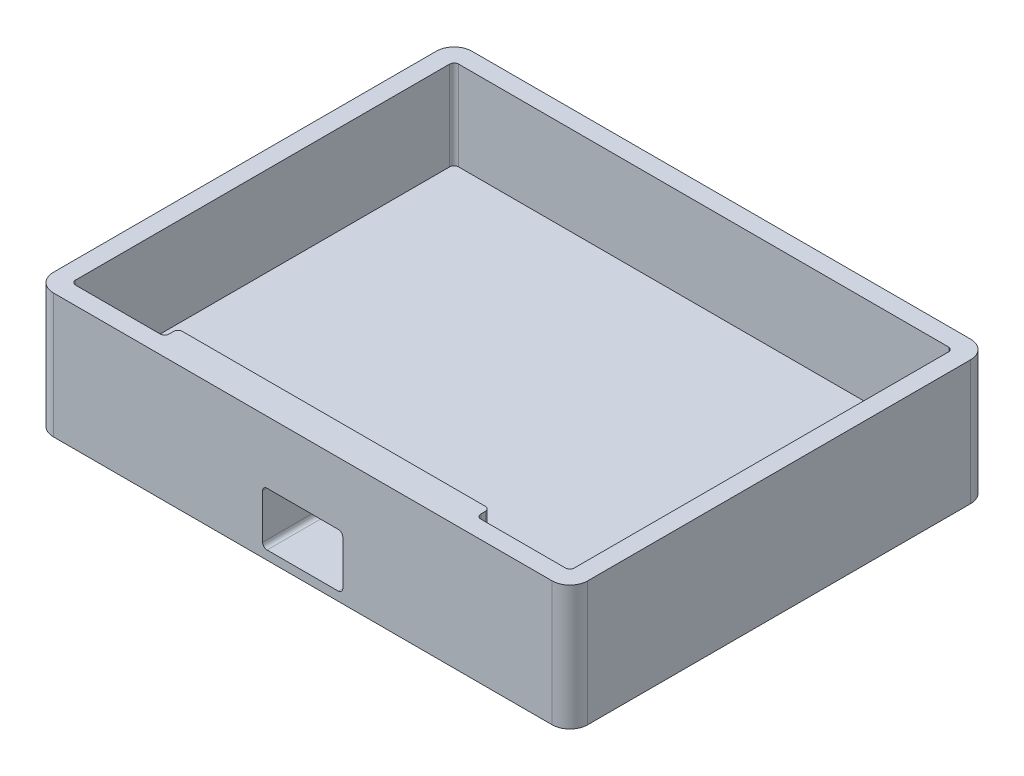
ISO-10303-21;
HEADER;
FILE_DESCRIPTION(('STEP AP214'),'2;1');
FILE_NAME('part.step','',(''),(''),'','','');
FILE_SCHEMA(('AUTOMOTIVE_DESIGN { 1 0 10303 214 1 1 1 1 }'));
ENDSEC;
DATA;
#1=APPLICATION_CONTEXT('core data for automotive mechanical design processes');
#2=APPLICATION_PROTOCOL_DEFINITION('international standard','automotive_design',2000,#1);
#3=PRODUCT_CONTEXT('',#1,'mechanical');
#4=PRODUCT('Part','Part','',(#3));
#5=PRODUCT_RELATED_PRODUCT_CATEGORY('part','',(#4));
#6=PRODUCT_DEFINITION_FORMATION('','',#4);
#7=PRODUCT_DEFINITION_CONTEXT('part definition',#1,'design');
#8=PRODUCT_DEFINITION('design','',#6,#7);
#9=PRODUCT_DEFINITION_SHAPE('','',#8);
#10=(LENGTH_UNIT() NAMED_UNIT(*) SI_UNIT(.MILLI.,.METRE.));
#11=(NAMED_UNIT(*) PLANE_ANGLE_UNIT() SI_UNIT($,.RADIAN.));
#12=(NAMED_UNIT(*) SI_UNIT($,.STERADIAN.) SOLID_ANGLE_UNIT());
#13=UNCERTAINTY_MEASURE_WITH_UNIT(LENGTH_MEASURE(1.E-05),#10,'distance_accuracy_value','');
#14=(GEOMETRIC_REPRESENTATION_CONTEXT(3) GLOBAL_UNCERTAINTY_ASSIGNED_CONTEXT((#13)) GLOBAL_UNIT_ASSIGNED_CONTEXT((#10,
#11,#12)) REPRESENTATION_CONTEXT('',''));
#15=CARTESIAN_POINT('',(0.,0.,0.));
#16=DIRECTION('',(0.,0.,1.));
#17=DIRECTION('',(1.,0.,0.));
#18=AXIS2_PLACEMENT_3D('',#15,#16,#17);
#19=CARTESIAN_POINT('',(0.,4.,0.));
#20=DIRECTION('',(0.,-1.,0.));
#21=DIRECTION('',(0.,0.,-1.));
#22=AXIS2_PLACEMENT_3D('',#19,#20,#21);
#23=PLANE('',#22);
#24=DIRECTION('',(0.,0.,-1.));
#25=VECTOR('',#24,1.);
#26=CARTESIAN_POINT('',(17.5,4.,0.));
#27=LINE('',#26,#25);
#28=CARTESIAN_POINT('',(17.5,4.,21.));
#29=VERTEX_POINT('',#28);
#30=CARTESIAN_POINT('',(17.5,4.,20.5));
#31=VERTEX_POINT('',#30);
#32=EDGE_CURVE('E394',#29,#31,#27,.T.);
#33=ORIENTED_EDGE('',*,*,#32,.F.);
#34=CARTESIAN_POINT('',(18.,4.,21.));
#35=DIRECTION('',(0.,-1.,0.));
#36=DIRECTION('',(0.,0.,-1.));
#37=AXIS2_PLACEMENT_3D('',#34,#35,#36);
#38=CIRCLE('',#37,0.5);
#39=CARTESIAN_POINT('',(18.,4.,21.5));
#40=VERTEX_POINT('',#39);
#41=EDGE_CURVE('E503',#29,#40,#38,.F.);
#42=ORIENTED_EDGE('',*,*,#41,.T.);
#43=DIRECTION('',(1.,0.,0.));
#44=VECTOR('',#43,1.);
#45=CARTESIAN_POINT('',(-28.,4.,21.5));
#46=LINE('',#45,#44);
#47=CARTESIAN_POINT('',(27.5,4.,21.5));
#48=VERTEX_POINT('',#47);
#49=EDGE_CURVE('E355',#40,#48,#46,.T.);
#50=ORIENTED_EDGE('',*,*,#49,.T.);
#51=CARTESIAN_POINT('',(27.5,4.,21.));
#52=DIRECTION('',(0.,-1.,0.));
#53=DIRECTION('',(0.,0.,-1.));
#54=AXIS2_PLACEMENT_3D('',#51,#52,#53);
#55=CIRCLE('',#54,0.5);
#56=CARTESIAN_POINT('',(28.,4.,21.));
#57=VERTEX_POINT('',#56);
#58=EDGE_CURVE('E492',#48,#57,#55,.F.);
#59=ORIENTED_EDGE('',*,*,#58,.T.);
#60=DIRECTION('',(0.,0.,-1.));
#61=VECTOR('',#60,1.);
#62=CARTESIAN_POINT('',(28.,4.,21.5));
#63=LINE('',#62,#61);
#64=CARTESIAN_POINT('',(28.,4.,-21.));
#65=VERTEX_POINT('',#64);
#66=EDGE_CURVE('E324',#57,#65,#63,.T.);
#67=ORIENTED_EDGE('',*,*,#66,.T.);
#68=CARTESIAN_POINT('',(27.5,4.,-21.));
#69=DIRECTION('',(0.,-1.,0.));
#70=DIRECTION('',(0.,0.,-1.));
#71=AXIS2_PLACEMENT_3D('',#68,#69,#70);
#72=CIRCLE('',#71,0.5);
#73=CARTESIAN_POINT('',(27.5,4.,-21.5));
#74=VERTEX_POINT('',#73);
#75=EDGE_CURVE('E494',#65,#74,#72,.F.);
#76=ORIENTED_EDGE('',*,*,#75,.T.);
#77=DIRECTION('',(-1.,0.,0.));
#78=VECTOR('',#77,1.);
#79=CARTESIAN_POINT('',(-28.,4.,-21.5));
#80=LINE('',#79,#78);
#81=CARTESIAN_POINT('',(-27.5,4.,-21.5));
#82=VERTEX_POINT('',#81);
#83=EDGE_CURVE('E347',#74,#82,#80,.T.);
#84=ORIENTED_EDGE('',*,*,#83,.T.);
#85=CARTESIAN_POINT('',(-27.5,4.,-21.));
#86=DIRECTION('',(0.,-1.,0.));
#87=DIRECTION('',(0.,0.,-1.));
#88=AXIS2_PLACEMENT_3D('',#85,#86,#87);
#89=CIRCLE('',#88,0.5);
#90=CARTESIAN_POINT('',(-28.,4.,-21.));
#91=VERTEX_POINT('',#90);
#92=EDGE_CURVE('E497',#82,#91,#89,.F.);
#93=ORIENTED_EDGE('',*,*,#92,.T.);
#94=DIRECTION('',(0.,0.,1.));
#95=VECTOR('',#94,1.);
#96=CARTESIAN_POINT('',(-28.,4.,21.5));
#97=LINE('',#96,#95);
#98=CARTESIAN_POINT('',(-28.,4.,21.));
#99=VERTEX_POINT('',#98);
#100=EDGE_CURVE('E351',#91,#99,#97,.T.);
#101=ORIENTED_EDGE('',*,*,#100,.T.);
#102=CARTESIAN_POINT('',(-27.5,4.,21.));
#103=DIRECTION('',(0.,-1.,0.));
#104=DIRECTION('',(0.,0.,-1.));
#105=AXIS2_PLACEMENT_3D('',#102,#103,#104);
#106=CIRCLE('',#105,0.5);
#107=CARTESIAN_POINT('',(-27.5,4.,21.5));
#108=VERTEX_POINT('',#107);
#109=EDGE_CURVE('E489',#99,#108,#106,.F.);
#110=ORIENTED_EDGE('',*,*,#109,.T.);
#111=CARTESIAN_POINT('',(-18.,4.,21.5));
#112=VERTEX_POINT('',#111);
#113=EDGE_CURVE('E330',#108,#112,#46,.T.);
#114=ORIENTED_EDGE('',*,*,#113,.T.);
#115=CARTESIAN_POINT('',(-18.,4.,21.));
#116=DIRECTION('',(0.,-1.,0.));
#117=DIRECTION('',(0.,0.,-1.));
#118=AXIS2_PLACEMENT_3D('',#115,#116,#117);
#119=CIRCLE('',#118,0.5);
#120=CARTESIAN_POINT('',(-17.5,4.,21.));
#121=VERTEX_POINT('',#120);
#122=EDGE_CURVE('E500',#112,#121,#119,.F.);
#123=ORIENTED_EDGE('',*,*,#122,.T.);
#124=DIRECTION('',(0.,0.,1.));
#125=VECTOR('',#124,1.);
#126=CARTESIAN_POINT('',(-17.5,4.,0.));
#127=LINE('',#126,#125);
#128=CARTESIAN_POINT('',(-17.5,4.,20.5));
#129=VERTEX_POINT('',#128);
#130=EDGE_CURVE('E398',#129,#121,#127,.T.);
#131=ORIENTED_EDGE('',*,*,#130,.F.);
#132=CARTESIAN_POINT('',(-17.,4.,20.5));
#133=DIRECTION('',(0.,-1.,0.));
#134=DIRECTION('',(0.,0.,-1.));
#135=AXIS2_PLACEMENT_3D('',#132,#133,#134);
#136=CIRCLE('',#135,0.5);
#137=CARTESIAN_POINT('',(-17.,4.,20.));
#138=VERTEX_POINT('',#137);
#139=EDGE_CURVE('E540',#129,#138,#136,.T.);
#140=ORIENTED_EDGE('',*,*,#139,.T.);
#141=DIRECTION('',(-1.,0.,0.));
#142=VECTOR('',#141,1.);
#143=CARTESIAN_POINT('',(0.,4.,20.));
#144=LINE('',#143,#142);
#145=CARTESIAN_POINT('',(-4.5,4.,20.));
#146=VERTEX_POINT('',#145);
#147=EDGE_CURVE('E300',#146,#138,#144,.T.);
#148=ORIENTED_EDGE('',*,*,#147,.F.);
#149=DIRECTION('',(0.,0.,1.));
#150=VECTOR('',#149,1.);
#151=CARTESIAN_POINT('',(-4.5,4.,0.));
#152=LINE('',#151,#150);
#153=CARTESIAN_POINT('',(-4.5,4.,15.5));
#154=VERTEX_POINT('',#153);
#155=EDGE_CURVE('E290',#154,#146,#152,.T.);
#156=ORIENTED_EDGE('',*,*,#155,.F.);
#157=DIRECTION('',(-1.,0.,0.));
#158=VECTOR('',#157,1.);
#159=CARTESIAN_POINT('',(0.,4.,15.5));
#160=LINE('',#159,#158);
#161=CARTESIAN_POINT('',(4.5,4.,15.5));
#162=VERTEX_POINT('',#161);
#163=EDGE_CURVE('E271',#162,#154,#160,.T.);
#164=ORIENTED_EDGE('',*,*,#163,.F.);
#165=DIRECTION('',(0.,0.,-1.));
#166=VECTOR('',#165,1.);
#167=CARTESIAN_POINT('',(4.5,4.,0.));
#168=LINE('',#167,#166);
#169=CARTESIAN_POINT('',(4.5,4.,20.));
#170=VERTEX_POINT('',#169);
#171=EDGE_CURVE('E302',#170,#162,#168,.T.);
#172=ORIENTED_EDGE('',*,*,#171,.F.);
#173=CARTESIAN_POINT('',(17.,4.,20.));
#174=VERTEX_POINT('',#173);
#175=EDGE_CURVE('E390',#174,#170,#144,.T.);
#176=ORIENTED_EDGE('',*,*,#175,.F.);
#177=CARTESIAN_POINT('',(17.,4.,20.5));
#178=DIRECTION('',(0.,-1.,0.));
#179=DIRECTION('',(0.,0.,-1.));
#180=AXIS2_PLACEMENT_3D('',#177,#178,#179);
#181=CIRCLE('',#180,0.5);
#182=EDGE_CURVE('E543',#174,#31,#181,.T.);
#183=ORIENTED_EDGE('',*,*,#182,.T.);
#184=EDGE_LOOP('',(#33,#42,#50,#59,#67,#76,#84,#93,#101,#110,#114,#123,#131,#140,#148,#156,#164,
#172,#176,#183));
#185=FACE_BOUND('',#184,.T.);
#186=ADVANCED_FACE('F49',(#185),#23,.F.);
#187=CARTESIAN_POINT('',(0.,0.,20.));
#188=DIRECTION('',(0.,0.,1.));
#189=DIRECTION('',(1.,0.,0.));
#190=AXIS2_PLACEMENT_3D('',#187,#188,#189);
#191=PLANE('',#190);
#192=ORIENTED_EDGE('',*,*,#147,.T.);
#193=DIRECTION('',(0.,1.,0.));
#194=VECTOR('',#193,1.);
#195=CARTESIAN_POINT('',(-17.,0.,20.));
#196=LINE('',#195,#194);
#197=CARTESIAN_POINT('',(-17.,14.,20.));
#198=VERTEX_POINT('',#197);
#199=EDGE_CURVE('E465',#138,#198,#196,.T.);
#200=ORIENTED_EDGE('',*,*,#199,.T.);
#201=DIRECTION('',(1.,0.,0.));
#202=VECTOR('',#201,1.);
#203=CARTESIAN_POINT('',(17.5,14.,20.));
#204=LINE('',#203,#202);
#205=CARTESIAN_POINT('',(17.,14.,20.));
#206=VERTEX_POINT('',#205);
#207=EDGE_CURVE('E308',#198,#206,#204,.T.);
#208=ORIENTED_EDGE('',*,*,#207,.T.);
#209=DIRECTION('',(0.,-1.,0.));
#210=VECTOR('',#209,1.);
#211=CARTESIAN_POINT('',(17.,0.,20.));
#212=LINE('',#211,#210);
#213=EDGE_CURVE('E461',#206,#174,#212,.T.);
#214=ORIENTED_EDGE('',*,*,#213,.T.);
#215=ORIENTED_EDGE('',*,*,#175,.T.);
#216=DIRECTION('',(0.,-1.,0.));
#217=VECTOR('',#216,1.);
#218=CARTESIAN_POINT('',(4.5,0.,20.));
#219=LINE('',#218,#217);
#220=CARTESIAN_POINT('',(4.5,6.5,20.));
#221=VERTEX_POINT('',#220);
#222=EDGE_CURVE('E284',#221,#170,#219,.T.);
#223=ORIENTED_EDGE('',*,*,#222,.F.);
#224=CARTESIAN_POINT('',(4.,6.5,20.));
#225=DIRECTION('',(0.,0.,1.));
#226=DIRECTION('',(1.,0.,0.));
#227=AXIS2_PLACEMENT_3D('',#224,#225,#226);
#228=CIRCLE('',#227,0.5);
#229=CARTESIAN_POINT('',(4.,7.,20.));
#230=VERTEX_POINT('',#229);
#231=EDGE_CURVE('E58',#221,#230,#228,.T.);
#232=ORIENTED_EDGE('',*,*,#231,.T.);
#233=DIRECTION('',(-1.,0.,0.));
#234=VECTOR('',#233,1.);
#235=CARTESIAN_POINT('',(0.,7.,20.));
#236=LINE('',#235,#234);
#237=CARTESIAN_POINT('',(-4.,7.,20.));
#238=VERTEX_POINT('',#237);
#239=EDGE_CURVE('E402',#230,#238,#236,.T.);
#240=ORIENTED_EDGE('',*,*,#239,.T.);
#241=CARTESIAN_POINT('',(-4.,6.5,20.));
#242=DIRECTION('',(0.,0.,1.));
#243=DIRECTION('',(1.,0.,0.));
#244=AXIS2_PLACEMENT_3D('',#241,#242,#243);
#245=CIRCLE('',#244,0.5);
#246=CARTESIAN_POINT('',(-4.5,6.5,20.));
#247=VERTEX_POINT('',#246);
#248=EDGE_CURVE('E605',#238,#247,#245,.T.);
#249=ORIENTED_EDGE('',*,*,#248,.T.);
#250=DIRECTION('',(0.,1.,0.));
#251=VECTOR('',#250,1.);
#252=CARTESIAN_POINT('',(-4.5,0.,20.));
#253=LINE('',#252,#251);
#254=EDGE_CURVE('E405',#146,#247,#253,.T.);
#255=ORIENTED_EDGE('',*,*,#254,.F.);
#256=EDGE_LOOP('',(#192,#200,#208,#214,#215,#223,#232,#240,#249,#255));
#257=FACE_BOUND('',#256,.T.);
#258=ADVANCED_FACE('F749',(#257),#191,.F.);
#259=CARTESIAN_POINT('',(-28.,14.,21.5));
#260=DIRECTION('',(0.,0.,-1.));
#261=DIRECTION('',(-1.,0.,0.));
#262=AXIS2_PLACEMENT_3D('',#259,#260,#261);
#263=PLANE('',#262);
#264=DIRECTION('',(1.,0.,0.));
#265=VECTOR('',#264,1.);
#266=CARTESIAN_POINT('',(-28.,14.,21.5));
#267=LINE('',#266,#265);
#268=CARTESIAN_POINT('',(-27.5,14.,21.5));
#269=VERTEX_POINT('',#268);
#270=CARTESIAN_POINT('',(-18.,14.,21.5));
#271=VERTEX_POINT('',#270);
#272=EDGE_CURVE('E339',#269,#271,#267,.T.);
#273=ORIENTED_EDGE('',*,*,#272,.T.);
#274=DIRECTION('',(0.,1.,0.));
#275=VECTOR('',#274,1.);
#276=CARTESIAN_POINT('',(-18.,14.,21.5));
#277=LINE('',#276,#275);
#278=EDGE_CURVE('E516',#271,#112,#277,.F.);
#279=ORIENTED_EDGE('',*,*,#278,.T.);
#280=ORIENTED_EDGE('',*,*,#113,.F.);
#281=DIRECTION('',(0.,-1.,0.));
#282=VECTOR('',#281,1.);
#283=CARTESIAN_POINT('',(-27.5,14.,21.5));
#284=LINE('',#283,#282);
#285=EDGE_CURVE('E513',#108,#269,#284,.F.);
#286=ORIENTED_EDGE('',*,*,#285,.T.);
#287=EDGE_LOOP('',(#273,#279,#280,#286));
#288=FACE_BOUND('',#287,.T.);
#289=ADVANCED_FACE('F805',(#288),#263,.T.);
#290=ORIENTED_EDGE('',*,*,#49,.F.);
#291=DIRECTION('',(0.,-1.,0.));
#292=VECTOR('',#291,1.);
#293=CARTESIAN_POINT('',(18.,14.,21.5));
#294=LINE('',#293,#292);
#295=CARTESIAN_POINT('',(18.,14.,21.5));
#296=VERTEX_POINT('',#295);
#297=EDGE_CURVE('E510',#40,#296,#294,.F.);
#298=ORIENTED_EDGE('',*,*,#297,.T.);
#299=CARTESIAN_POINT('',(27.5,14.,21.5));
#300=VERTEX_POINT('',#299);
#301=EDGE_CURVE('E338',#296,#300,#267,.T.);
#302=ORIENTED_EDGE('',*,*,#301,.T.);
#303=DIRECTION('',(0.,-1.,0.));
#304=VECTOR('',#303,1.);
#305=CARTESIAN_POINT('',(27.5,4.,21.5));
#306=LINE('',#305,#304);
#307=EDGE_CURVE('E506',#300,#48,#306,.T.);
#308=ORIENTED_EDGE('',*,*,#307,.T.);
#309=EDGE_LOOP('',(#290,#298,#302,#308));
#310=FACE_BOUND('',#309,.T.);
#311=ADVANCED_FACE('F769',(#310),#263,.T.);
#312=CARTESIAN_POINT('',(30.,4.,23.5));
#313=DIRECTION('',(-1.,0.,0.));
#314=DIRECTION('',(0.,0.,1.));
#315=AXIS2_PLACEMENT_3D('',#312,#313,#314);
#316=PLANE('',#315);
#317=DIRECTION('',(0.,0.,-1.));
#318=VECTOR('',#317,1.);
#319=CARTESIAN_POINT('',(30.,0.,23.5));
#320=LINE('',#319,#318);
#321=CARTESIAN_POINT('',(30.,0.,21.5));
#322=VERTEX_POINT('',#321);
#323=CARTESIAN_POINT('',(30.,0.,-21.5));
#324=VERTEX_POINT('',#323);
#325=EDGE_CURVE('E374',#322,#324,#320,.T.);
#326=ORIENTED_EDGE('',*,*,#325,.T.);
#327=DIRECTION('',(0.,-1.,0.));
#328=VECTOR('',#327,1.);
#329=CARTESIAN_POINT('',(30.,4.,-21.5));
#330=LINE('',#329,#328);
#331=CARTESIAN_POINT('',(30.,14.,-21.5));
#332=VERTEX_POINT('',#331);
#333=EDGE_CURVE('E432',#324,#332,#330,.F.);
#334=ORIENTED_EDGE('',*,*,#333,.T.);
#335=DIRECTION('',(0.,0.,-1.));
#336=VECTOR('',#335,1.);
#337=CARTESIAN_POINT('',(30.,14.,23.5));
#338=LINE('',#337,#336);
#339=CARTESIAN_POINT('',(30.,14.,21.5));
#340=VERTEX_POINT('',#339);
#341=EDGE_CURVE('E343',#340,#332,#338,.T.);
#342=ORIENTED_EDGE('',*,*,#341,.F.);
#343=DIRECTION('',(0.,-1.,0.));
#344=VECTOR('',#343,1.);
#345=CARTESIAN_POINT('',(30.,4.,21.5));
#346=LINE('',#345,#344);
#347=EDGE_CURVE('E428',#340,#322,#346,.T.);
#348=ORIENTED_EDGE('',*,*,#347,.T.);
#349=EDGE_LOOP('',(#326,#334,#342,#348));
#350=FACE_BOUND('',#349,.T.);
#351=ADVANCED_FACE('F854',(#350),#316,.F.);
#352=CARTESIAN_POINT('',(-30.,4.,-23.5));
#353=DIRECTION('',(0.,0.,1.));
#354=DIRECTION('',(1.,0.,0.));
#355=AXIS2_PLACEMENT_3D('',#352,#353,#354);
#356=PLANE('',#355);
#357=DIRECTION('',(-1.,0.,0.));
#358=VECTOR('',#357,1.);
#359=CARTESIAN_POINT('',(-30.,14.,-23.5));
#360=LINE('',#359,#358);
#361=CARTESIAN_POINT('',(28.,14.,-23.5));
#362=VERTEX_POINT('',#361);
#363=CARTESIAN_POINT('',(-28.,14.,-23.5));
#364=VERTEX_POINT('',#363);
#365=EDGE_CURVE('E362',#362,#364,#360,.T.);
#366=ORIENTED_EDGE('',*,*,#365,.F.);
#367=DIRECTION('',(0.,-1.,0.));
#368=VECTOR('',#367,1.);
#369=CARTESIAN_POINT('',(28.,4.,-23.5));
#370=LINE('',#369,#368);
#371=CARTESIAN_POINT('',(28.,0.,-23.5));
#372=VERTEX_POINT('',#371);
#373=EDGE_CURVE('E412',#362,#372,#370,.T.);
#374=ORIENTED_EDGE('',*,*,#373,.T.);
#375=DIRECTION('',(-1.,0.,0.));
#376=VECTOR('',#375,1.);
#377=CARTESIAN_POINT('',(-30.,0.,-23.5));
#378=LINE('',#377,#376);
#379=CARTESIAN_POINT('',(-28.,0.,-23.5));
#380=VERTEX_POINT('',#379);
#381=EDGE_CURVE('E378',#372,#380,#378,.T.);
#382=ORIENTED_EDGE('',*,*,#381,.T.);
#383=DIRECTION('',(0.,-1.,0.));
#384=VECTOR('',#383,1.);
#385=CARTESIAN_POINT('',(-28.,4.,-23.5));
#386=LINE('',#385,#384);
#387=EDGE_CURVE('E283',#380,#364,#386,.F.);
#388=ORIENTED_EDGE('',*,*,#387,.T.);
#389=EDGE_LOOP('',(#366,#374,#382,#388));
#390=FACE_BOUND('',#389,.T.);
#391=ADVANCED_FACE('F850',(#390),#356,.F.);
#392=CARTESIAN_POINT('',(-30.,4.,23.5));
#393=DIRECTION('',(1.,0.,0.));
#394=DIRECTION('',(0.,0.,-1.));
#395=AXIS2_PLACEMENT_3D('',#392,#393,#394);
#396=PLANE('',#395);
#397=DIRECTION('',(0.,0.,1.));
#398=VECTOR('',#397,1.);
#399=CARTESIAN_POINT('',(-30.,0.,23.5));
#400=LINE('',#399,#398);
#401=CARTESIAN_POINT('',(-30.,0.,-21.5));
#402=VERTEX_POINT('',#401);
#403=CARTESIAN_POINT('',(-30.,0.,21.5));
#404=VERTEX_POINT('',#403);
#405=EDGE_CURVE('E382',#402,#404,#400,.T.);
#406=ORIENTED_EDGE('',*,*,#405,.T.);
#407=DIRECTION('',(0.,-1.,0.));
#408=VECTOR('',#407,1.);
#409=CARTESIAN_POINT('',(-30.,4.,21.5));
#410=LINE('',#409,#408);
#411=CARTESIAN_POINT('',(-30.,14.,21.5));
#412=VERTEX_POINT('',#411);
#413=EDGE_CURVE('E458',#404,#412,#410,.F.);
#414=ORIENTED_EDGE('',*,*,#413,.T.);
#415=DIRECTION('',(0.,0.,1.));
#416=VECTOR('',#415,1.);
#417=CARTESIAN_POINT('',(-30.,14.,23.5));
#418=LINE('',#417,#416);
#419=CARTESIAN_POINT('',(-30.,14.,-21.5));
#420=VERTEX_POINT('',#419);
#421=EDGE_CURVE('E366',#420,#412,#418,.T.);
#422=ORIENTED_EDGE('',*,*,#421,.F.);
#423=DIRECTION('',(0.,-1.,0.));
#424=VECTOR('',#423,1.);
#425=CARTESIAN_POINT('',(-30.,4.,-21.5));
#426=LINE('',#425,#424);
#427=EDGE_CURVE('E454',#420,#402,#426,.T.);
#428=ORIENTED_EDGE('',*,*,#427,.T.);
#429=EDGE_LOOP('',(#406,#414,#422,#428));
#430=FACE_BOUND('',#429,.T.);
#431=ADVANCED_FACE('F847',(#430),#396,.F.);
#432=CARTESIAN_POINT('',(-30.,4.,23.5));
#433=DIRECTION('',(0.,0.,-1.));
#434=DIRECTION('',(-1.,0.,0.));
#435=AXIS2_PLACEMENT_3D('',#432,#433,#434);
#436=PLANE('',#435);
#437=DIRECTION('',(0.,-1.,0.));
#438=VECTOR('',#437,1.);
#439=CARTESIAN_POINT('',(-4.5,7.,23.5));
#440=LINE('',#439,#438);
#441=CARTESIAN_POINT('',(-4.5,6.5,23.5));
#442=VERTEX_POINT('',#441);
#443=CARTESIAN_POINT('',(-4.5,1.5,23.5));
#444=VERTEX_POINT('',#443);
#445=EDGE_CURVE('E295',#442,#444,#440,.T.);
#446=ORIENTED_EDGE('',*,*,#445,.F.);
#447=CARTESIAN_POINT('',(-4.,6.5,23.5));
#448=DIRECTION('',(0.,0.,-1.));
#449=DIRECTION('',(-1.,0.,0.));
#450=AXIS2_PLACEMENT_3D('',#447,#448,#449);
#451=CIRCLE('',#450,0.5);
#452=CARTESIAN_POINT('',(-4.,7.,23.5));
#453=VERTEX_POINT('',#452);
#454=EDGE_CURVE('E602',#442,#453,#451,.T.);
#455=ORIENTED_EDGE('',*,*,#454,.T.);
#456=DIRECTION('',(1.,0.,0.));
#457=VECTOR('',#456,1.);
#458=CARTESIAN_POINT('',(-4.5,7.,23.5));
#459=LINE('',#458,#457);
#460=CARTESIAN_POINT('',(4.,7.,23.5));
#461=VERTEX_POINT('',#460);
#462=EDGE_CURVE('E639',#453,#461,#459,.T.);
#463=ORIENTED_EDGE('',*,*,#462,.T.);
#464=CARTESIAN_POINT('',(4.,6.5,23.5));
#465=DIRECTION('',(0.,0.,-1.));
#466=DIRECTION('',(-1.,0.,0.));
#467=AXIS2_PLACEMENT_3D('',#464,#465,#466);
#468=CIRCLE('',#467,0.5);
#469=CARTESIAN_POINT('',(4.5,6.5,23.5));
#470=VERTEX_POINT('',#469);
#471=EDGE_CURVE('E11',#461,#470,#468,.T.);
#472=ORIENTED_EDGE('',*,*,#471,.T.);
#473=DIRECTION('',(0.,-1.,0.));
#474=VECTOR('',#473,1.);
#475=CARTESIAN_POINT('',(4.5,7.,23.5));
#476=LINE('',#475,#474);
#477=CARTESIAN_POINT('',(4.5,1.5,23.5));
#478=VERTEX_POINT('',#477);
#479=EDGE_CURVE('E701',#470,#478,#476,.T.);
#480=ORIENTED_EDGE('',*,*,#479,.T.);
#481=CARTESIAN_POINT('',(4.,1.5,23.5));
#482=DIRECTION('',(0.,0.,-1.));
#483=DIRECTION('',(-1.,0.,0.));
#484=AXIS2_PLACEMENT_3D('',#481,#482,#483);
#485=CIRCLE('',#484,0.5);
#486=CARTESIAN_POINT('',(4.,1.,23.5));
#487=VERTEX_POINT('',#486);
#488=EDGE_CURVE('E596',#478,#487,#485,.T.);
#489=ORIENTED_EDGE('',*,*,#488,.T.);
#490=DIRECTION('',(1.,0.,0.));
#491=VECTOR('',#490,1.);
#492=CARTESIAN_POINT('',(-4.5,1.,23.5));
#493=LINE('',#492,#491);
#494=CARTESIAN_POINT('',(-4.,1.,23.5));
#495=VERTEX_POINT('',#494);
#496=EDGE_CURVE('E636',#495,#487,#493,.T.);
#497=ORIENTED_EDGE('',*,*,#496,.F.);
#498=CARTESIAN_POINT('',(-4.,1.5,23.5));
#499=DIRECTION('',(0.,0.,-1.));
#500=DIRECTION('',(-1.,0.,0.));
#501=AXIS2_PLACEMENT_3D('',#498,#499,#500);
#502=CIRCLE('',#501,0.5);
#503=EDGE_CURVE('E599',#495,#444,#502,.T.);
#504=ORIENTED_EDGE('',*,*,#503,.T.);
#505=EDGE_LOOP('',(#446,#455,#463,#472,#480,#489,#497,#504));
#506=FACE_BOUND('',#505,.T.);
#507=DIRECTION('',(1.,0.,0.));
#508=VECTOR('',#507,1.);
#509=CARTESIAN_POINT('',(-30.,0.,23.5));
#510=LINE('',#509,#508);
#511=CARTESIAN_POINT('',(-28.,0.,23.5));
#512=VERTEX_POINT('',#511);
#513=CARTESIAN_POINT('',(28.,0.,23.5));
#514=VERTEX_POINT('',#513);
#515=EDGE_CURVE('E386',#512,#514,#510,.T.);
#516=ORIENTED_EDGE('',*,*,#515,.T.);
#517=DIRECTION('',(0.,-1.,0.));
#518=VECTOR('',#517,1.);
#519=CARTESIAN_POINT('',(28.,4.,23.5));
#520=LINE('',#519,#518);
#521=CARTESIAN_POINT('',(28.,14.,23.5));
#522=VERTEX_POINT('',#521);
#523=EDGE_CURVE('E451',#514,#522,#520,.F.);
#524=ORIENTED_EDGE('',*,*,#523,.T.);
#525=DIRECTION('',(1.,0.,0.));
#526=VECTOR('',#525,1.);
#527=CARTESIAN_POINT('',(-30.,14.,23.5));
#528=LINE('',#527,#526);
#529=CARTESIAN_POINT('',(-28.,14.,23.5));
#530=VERTEX_POINT('',#529);
#531=EDGE_CURVE('E370',#530,#522,#528,.T.);
#532=ORIENTED_EDGE('',*,*,#531,.F.);
#533=DIRECTION('',(0.,-1.,0.));
#534=VECTOR('',#533,1.);
#535=CARTESIAN_POINT('',(-28.,4.,23.5));
#536=LINE('',#535,#534);
#537=EDGE_CURVE('E447',#530,#512,#536,.T.);
#538=ORIENTED_EDGE('',*,*,#537,.T.);
#539=EDGE_LOOP('',(#516,#524,#532,#538));
#540=FACE_BOUND('',#539,.T.);
#541=ADVANCED_FACE('F823',(#506,#540),#436,.F.);
#542=CARTESIAN_POINT('',(0.,0.,0.));
#543=DIRECTION('',(0.,-1.,0.));
#544=DIRECTION('',(0.,0.,-1.));
#545=AXIS2_PLACEMENT_3D('',#542,#543,#544);
#546=PLANE('',#545);
#547=ORIENTED_EDGE('',*,*,#381,.F.);
#548=CARTESIAN_POINT('',(28.,0.,-21.5));
#549=DIRECTION('',(0.,-1.,0.));
#550=DIRECTION('',(0.,0.,-1.));
#551=AXIS2_PLACEMENT_3D('',#548,#549,#550);
#552=CIRCLE('',#551,2.);
#553=EDGE_CURVE('E425',#372,#324,#552,.T.);
#554=ORIENTED_EDGE('',*,*,#553,.T.);
#555=ORIENTED_EDGE('',*,*,#325,.F.);
#556=CARTESIAN_POINT('',(28.,0.,21.5));
#557=DIRECTION('',(0.,-1.,0.));
#558=DIRECTION('',(0.,0.,-1.));
#559=AXIS2_PLACEMENT_3D('',#556,#557,#558);
#560=CIRCLE('',#559,2.);
#561=EDGE_CURVE('E422',#322,#514,#560,.T.);
#562=ORIENTED_EDGE('',*,*,#561,.T.);
#563=ORIENTED_EDGE('',*,*,#515,.F.);
#564=CARTESIAN_POINT('',(-28.,0.,21.5));
#565=DIRECTION('',(0.,-1.,0.));
#566=DIRECTION('',(0.,0.,-1.));
#567=AXIS2_PLACEMENT_3D('',#564,#565,#566);
#568=CIRCLE('',#567,2.);
#569=EDGE_CURVE('E419',#512,#404,#568,.T.);
#570=ORIENTED_EDGE('',*,*,#569,.T.);
#571=ORIENTED_EDGE('',*,*,#405,.F.);
#572=CARTESIAN_POINT('',(-28.,0.,-21.5));
#573=DIRECTION('',(0.,-1.,0.));
#574=DIRECTION('',(0.,0.,-1.));
#575=AXIS2_PLACEMENT_3D('',#572,#573,#574);
#576=CIRCLE('',#575,2.);
#577=EDGE_CURVE('E416',#402,#380,#576,.T.);
#578=ORIENTED_EDGE('',*,*,#577,.T.);
#579=EDGE_LOOP('',(#547,#554,#555,#562,#563,#570,#571,#578));
#580=FACE_BOUND('',#579,.T.);
#581=ADVANCED_FACE('F841',(#580),#546,.T.);
#582=CARTESIAN_POINT('',(0.,14.,0.));
#583=DIRECTION('',(0.,-1.,0.));
#584=DIRECTION('',(0.,0.,-1.));
#585=AXIS2_PLACEMENT_3D('',#582,#583,#584);
#586=PLANE('',#585);
#587=ORIENTED_EDGE('',*,*,#341,.T.);
#588=CARTESIAN_POINT('',(28.,14.,-21.5));
#589=DIRECTION('',(0.,-1.,0.));
#590=DIRECTION('',(0.,0.,-1.));
#591=AXIS2_PLACEMENT_3D('',#588,#589,#590);
#592=CIRCLE('',#591,2.);
#593=EDGE_CURVE('E444',#332,#362,#592,.F.);
#594=ORIENTED_EDGE('',*,*,#593,.T.);
#595=ORIENTED_EDGE('',*,*,#365,.T.);
#596=CARTESIAN_POINT('',(-28.,14.,-21.5));
#597=DIRECTION('',(0.,-1.,0.));
#598=DIRECTION('',(0.,0.,-1.));
#599=AXIS2_PLACEMENT_3D('',#596,#597,#598);
#600=CIRCLE('',#599,2.);
#601=EDGE_CURVE('E435',#364,#420,#600,.F.);
#602=ORIENTED_EDGE('',*,*,#601,.T.);
#603=ORIENTED_EDGE('',*,*,#421,.T.);
#604=CARTESIAN_POINT('',(-28.,14.,21.5));
#605=DIRECTION('',(0.,-1.,0.));
#606=DIRECTION('',(0.,0.,-1.));
#607=AXIS2_PLACEMENT_3D('',#604,#605,#606);
#608=CIRCLE('',#607,2.);
#609=EDGE_CURVE('E438',#412,#530,#608,.F.);
#610=ORIENTED_EDGE('',*,*,#609,.T.);
#611=ORIENTED_EDGE('',*,*,#531,.T.);
#612=CARTESIAN_POINT('',(28.,14.,21.5));
#613=DIRECTION('',(0.,-1.,0.));
#614=DIRECTION('',(0.,0.,-1.));
#615=AXIS2_PLACEMENT_3D('',#612,#613,#614);
#616=CIRCLE('',#615,2.);
#617=EDGE_CURVE('E441',#522,#340,#616,.F.);
#618=ORIENTED_EDGE('',*,*,#617,.T.);
#619=EDGE_LOOP('',(#587,#594,#595,#602,#603,#610,#611,#618));
#620=FACE_BOUND('',#619,.T.);
#621=ORIENTED_EDGE('',*,*,#207,.F.);
#622=CARTESIAN_POINT('',(-17.,14.,20.5));
#623=DIRECTION('',(0.,-1.,0.));
#624=DIRECTION('',(0.,0.,-1.));
#625=AXIS2_PLACEMENT_3D('',#622,#623,#624);
#626=CIRCLE('',#625,0.5);
#627=CARTESIAN_POINT('',(-17.5,14.,20.5));
#628=VERTEX_POINT('',#627);
#629=EDGE_CURVE('E472',#198,#628,#626,.F.);
#630=ORIENTED_EDGE('',*,*,#629,.T.);
#631=DIRECTION('',(0.,0.,1.));
#632=VECTOR('',#631,1.);
#633=CARTESIAN_POINT('',(-17.5,14.,20.));
#634=LINE('',#633,#632);
#635=CARTESIAN_POINT('',(-17.5,14.,21.));
#636=VERTEX_POINT('',#635);
#637=EDGE_CURVE('E320',#628,#636,#634,.T.);
#638=ORIENTED_EDGE('',*,*,#637,.T.);
#639=CARTESIAN_POINT('',(-18.,14.,21.));
#640=DIRECTION('',(0.,-1.,0.));
#641=DIRECTION('',(0.,0.,-1.));
#642=AXIS2_PLACEMENT_3D('',#639,#640,#641);
#643=CIRCLE('',#642,0.5);
#644=EDGE_CURVE('E549',#636,#271,#643,.T.);
#645=ORIENTED_EDGE('',*,*,#644,.T.);
#646=ORIENTED_EDGE('',*,*,#272,.F.);
#647=CARTESIAN_POINT('',(-27.5,14.,21.));
#648=DIRECTION('',(0.,-1.,0.));
#649=DIRECTION('',(0.,0.,-1.));
#650=AXIS2_PLACEMENT_3D('',#647,#648,#649);
#651=CIRCLE('',#650,0.5);
#652=CARTESIAN_POINT('',(-28.,14.,21.));
#653=VERTEX_POINT('',#652);
#654=EDGE_CURVE('E561',#269,#653,#651,.T.);
#655=ORIENTED_EDGE('',*,*,#654,.T.);
#656=DIRECTION('',(0.,0.,1.));
#657=VECTOR('',#656,1.);
#658=CARTESIAN_POINT('',(-28.,14.,21.5));
#659=LINE('',#658,#657);
#660=CARTESIAN_POINT('',(-28.,14.,-21.));
#661=VERTEX_POINT('',#660);
#662=EDGE_CURVE('E334',#661,#653,#659,.T.);
#663=ORIENTED_EDGE('',*,*,#662,.F.);
#664=CARTESIAN_POINT('',(-27.5,14.,-21.));
#665=DIRECTION('',(0.,-1.,0.));
#666=DIRECTION('',(0.,0.,-1.));
#667=AXIS2_PLACEMENT_3D('',#664,#665,#666);
#668=CIRCLE('',#667,0.5);
#669=CARTESIAN_POINT('',(-27.5,14.,-21.5));
#670=VERTEX_POINT('',#669);
#671=EDGE_CURVE('E552',#661,#670,#668,.T.);
#672=ORIENTED_EDGE('',*,*,#671,.T.);
#673=DIRECTION('',(-1.,0.,0.));
#674=VECTOR('',#673,1.);
#675=CARTESIAN_POINT('',(-28.,14.,-21.5));
#676=LINE('',#675,#674);
#677=CARTESIAN_POINT('',(27.5,14.,-21.5));
#678=VERTEX_POINT('',#677);
#679=EDGE_CURVE('E329',#678,#670,#676,.T.);
#680=ORIENTED_EDGE('',*,*,#679,.F.);
#681=CARTESIAN_POINT('',(27.5,14.,-21.));
#682=DIRECTION('',(0.,-1.,0.));
#683=DIRECTION('',(0.,0.,-1.));
#684=AXIS2_PLACEMENT_3D('',#681,#682,#683);
#685=CIRCLE('',#684,0.5);
#686=CARTESIAN_POINT('',(28.,14.,-21.));
#687=VERTEX_POINT('',#686);
#688=EDGE_CURVE('E555',#678,#687,#685,.T.);
#689=ORIENTED_EDGE('',*,*,#688,.T.);
#690=DIRECTION('',(0.,0.,-1.));
#691=VECTOR('',#690,1.);
#692=CARTESIAN_POINT('',(28.,14.,21.5));
#693=LINE('',#692,#691);
#694=CARTESIAN_POINT('',(28.,14.,21.));
#695=VERTEX_POINT('',#694);
#696=EDGE_CURVE('E325',#695,#687,#693,.T.);
#697=ORIENTED_EDGE('',*,*,#696,.F.);
#698=CARTESIAN_POINT('',(27.5,14.,21.));
#699=DIRECTION('',(0.,-1.,0.));
#700=DIRECTION('',(0.,0.,-1.));
#701=AXIS2_PLACEMENT_3D('',#698,#699,#700);
#702=CIRCLE('',#701,0.5);
#703=EDGE_CURVE('E558',#695,#300,#702,.T.);
#704=ORIENTED_EDGE('',*,*,#703,.T.);
#705=ORIENTED_EDGE('',*,*,#301,.F.);
#706=CARTESIAN_POINT('',(18.,14.,21.));
#707=DIRECTION('',(0.,-1.,0.));
#708=DIRECTION('',(0.,0.,-1.));
#709=AXIS2_PLACEMENT_3D('',#706,#707,#708);
#710=CIRCLE('',#709,0.5);
#711=CARTESIAN_POINT('',(17.5,14.,21.));
#712=VERTEX_POINT('',#711);
#713=EDGE_CURVE('E546',#296,#712,#710,.T.);
#714=ORIENTED_EDGE('',*,*,#713,.T.);
#715=DIRECTION('',(0.,0.,1.));
#716=VECTOR('',#715,1.);
#717=CARTESIAN_POINT('',(17.5,14.,20.));
#718=LINE('',#717,#716);
#719=CARTESIAN_POINT('',(17.5,14.,20.5));
#720=VERTEX_POINT('',#719);
#721=EDGE_CURVE('E316',#720,#712,#718,.T.);
#722=ORIENTED_EDGE('',*,*,#721,.F.);
#723=CARTESIAN_POINT('',(17.,14.,20.5));
#724=DIRECTION('',(0.,-1.,0.));
#725=DIRECTION('',(0.,0.,-1.));
#726=AXIS2_PLACEMENT_3D('',#723,#724,#725);
#727=CIRCLE('',#726,0.5);
#728=EDGE_CURVE('E469',#720,#206,#727,.F.);
#729=ORIENTED_EDGE('',*,*,#728,.T.);
#730=EDGE_LOOP('',(#621,#630,#638,#645,#646,#655,#663,#672,#680,#689,#697,#704,#705,#714,#722,#729));
#731=FACE_BOUND('',#730,.T.);
#732=ADVANCED_FACE('F761',(#620,#731),#586,.F.);
#733=CARTESIAN_POINT('',(28.,14.,21.5));
#734=DIRECTION('',(-1.,0.,0.));
#735=DIRECTION('',(0.,0.,1.));
#736=AXIS2_PLACEMENT_3D('',#733,#734,#735);
#737=PLANE('',#736);
#738=ORIENTED_EDGE('',*,*,#696,.T.);
#739=DIRECTION('',(0.,-1.,0.));
#740=VECTOR('',#739,1.);
#741=CARTESIAN_POINT('',(28.,4.,-21.));
#742=LINE('',#741,#740);
#743=EDGE_CURVE('E536',#687,#65,#742,.T.);
#744=ORIENTED_EDGE('',*,*,#743,.T.);
#745=ORIENTED_EDGE('',*,*,#66,.F.);
#746=DIRECTION('',(0.,-1.,0.));
#747=VECTOR('',#746,1.);
#748=CARTESIAN_POINT('',(28.,14.,21.));
#749=LINE('',#748,#747);
#750=EDGE_CURVE('E533',#57,#695,#749,.F.);
#751=ORIENTED_EDGE('',*,*,#750,.T.);
#752=EDGE_LOOP('',(#738,#744,#745,#751));
#753=FACE_BOUND('',#752,.T.);
#754=ADVANCED_FACE('F777',(#753),#737,.T.);
#755=CARTESIAN_POINT('',(-28.,14.,-21.5));
#756=DIRECTION('',(0.,0.,1.));
#757=DIRECTION('',(1.,0.,0.));
#758=AXIS2_PLACEMENT_3D('',#755,#756,#757);
#759=PLANE('',#758);
#760=ORIENTED_EDGE('',*,*,#679,.T.);
#761=DIRECTION('',(0.,-1.,0.));
#762=VECTOR('',#761,1.);
#763=CARTESIAN_POINT('',(-27.5,4.,-21.5));
#764=LINE('',#763,#762);
#765=EDGE_CURVE('E522',#670,#82,#764,.T.);
#766=ORIENTED_EDGE('',*,*,#765,.T.);
#767=ORIENTED_EDGE('',*,*,#83,.F.);
#768=DIRECTION('',(0.,-1.,0.));
#769=VECTOR('',#768,1.);
#770=CARTESIAN_POINT('',(27.5,14.,-21.5));
#771=LINE('',#770,#769);
#772=EDGE_CURVE('E519',#74,#678,#771,.F.);
#773=ORIENTED_EDGE('',*,*,#772,.T.);
#774=EDGE_LOOP('',(#760,#766,#767,#773));
#775=FACE_BOUND('',#774,.T.);
#776=ADVANCED_FACE('F786',(#775),#759,.T.);
#777=CARTESIAN_POINT('',(-28.,14.,21.5));
#778=DIRECTION('',(1.,0.,0.));
#779=DIRECTION('',(0.,0.,-1.));
#780=AXIS2_PLACEMENT_3D('',#777,#778,#779);
#781=PLANE('',#780);
#782=ORIENTED_EDGE('',*,*,#100,.F.);
#783=DIRECTION('',(0.,-1.,0.));
#784=VECTOR('',#783,1.);
#785=CARTESIAN_POINT('',(-28.,14.,-21.));
#786=LINE('',#785,#784);
#787=EDGE_CURVE('E530',#91,#661,#786,.F.);
#788=ORIENTED_EDGE('',*,*,#787,.T.);
#789=ORIENTED_EDGE('',*,*,#662,.T.);
#790=DIRECTION('',(0.,-1.,0.));
#791=VECTOR('',#790,1.);
#792=CARTESIAN_POINT('',(-28.,4.,21.));
#793=LINE('',#792,#791);
#794=EDGE_CURVE('E526',#653,#99,#793,.T.);
#795=ORIENTED_EDGE('',*,*,#794,.T.);
#796=EDGE_LOOP('',(#782,#788,#789,#795));
#797=FACE_BOUND('',#796,.T.);
#798=ADVANCED_FACE('F795',(#797),#781,.T.);
#799=CARTESIAN_POINT('',(-17.5,2.,20.));
#800=DIRECTION('',(1.,0.,0.));
#801=DIRECTION('',(0.,1.,0.));
#802=AXIS2_PLACEMENT_3D('',#799,#800,#801);
#803=PLANE('',#802);
#804=ORIENTED_EDGE('',*,*,#637,.F.);
#805=DIRECTION('',(0.,1.,0.));
#806=VECTOR('',#805,1.);
#807=CARTESIAN_POINT('',(-17.5,2.,20.5));
#808=LINE('',#807,#806);
#809=EDGE_CURVE('E479',#628,#129,#808,.F.);
#810=ORIENTED_EDGE('',*,*,#809,.T.);
#811=ORIENTED_EDGE('',*,*,#130,.T.);
#812=DIRECTION('',(0.,1.,0.));
#813=VECTOR('',#812,1.);
#814=CARTESIAN_POINT('',(-17.5,2.,21.));
#815=LINE('',#814,#813);
#816=EDGE_CURVE('E475',#121,#636,#815,.T.);
#817=ORIENTED_EDGE('',*,*,#816,.T.);
#818=EDGE_LOOP('',(#804,#810,#811,#817));
#819=FACE_BOUND('',#818,.T.);
#820=ADVANCED_FACE('F815',(#819),#803,.F.);
#821=CARTESIAN_POINT('',(17.5,2.,20.));
#822=DIRECTION('',(-1.,0.,0.));
#823=DIRECTION('',(0.,0.,1.));
#824=AXIS2_PLACEMENT_3D('',#821,#822,#823);
#825=PLANE('',#824);
#826=ORIENTED_EDGE('',*,*,#32,.T.);
#827=DIRECTION('',(0.,-1.,0.));
#828=VECTOR('',#827,1.);
#829=CARTESIAN_POINT('',(17.5,2.,20.5));
#830=LINE('',#829,#828);
#831=EDGE_CURVE('E486',#31,#720,#830,.F.);
#832=ORIENTED_EDGE('',*,*,#831,.T.);
#833=ORIENTED_EDGE('',*,*,#721,.T.);
#834=DIRECTION('',(0.,-1.,0.));
#835=VECTOR('',#834,1.);
#836=CARTESIAN_POINT('',(17.5,2.,21.));
#837=LINE('',#836,#835);
#838=EDGE_CURVE('E482',#712,#29,#837,.T.);
#839=ORIENTED_EDGE('',*,*,#838,.T.);
#840=EDGE_LOOP('',(#826,#832,#833,#839));
#841=FACE_BOUND('',#840,.T.);
#842=ADVANCED_FACE('F758',(#841),#825,.F.);
#843=CARTESIAN_POINT('',(-4.5,7.,15.5));
#844=DIRECTION('',(0.,0.,1.));
#845=DIRECTION('',(1.,0.,0.));
#846=AXIS2_PLACEMENT_3D('',#843,#844,#845);
#847=PLANE('',#846);
#848=DIRECTION('',(-1.,0.,0.));
#849=VECTOR('',#848,1.);
#850=CARTESIAN_POINT('',(-4.5,1.,15.5));
#851=LINE('',#850,#849);
#852=CARTESIAN_POINT('',(4.,1.,15.5));
#853=VERTEX_POINT('',#852);
#854=CARTESIAN_POINT('',(-4.,1.,15.5));
#855=VERTEX_POINT('',#854);
#856=EDGE_CURVE('E640',#853,#855,#851,.T.);
#857=ORIENTED_EDGE('',*,*,#856,.F.);
#858=CARTESIAN_POINT('',(4.,1.5,15.5));
#859=DIRECTION('',(0.,0.,1.));
#860=DIRECTION('',(1.,0.,0.));
#861=AXIS2_PLACEMENT_3D('',#858,#859,#860);
#862=CIRCLE('',#861,0.5);
#863=CARTESIAN_POINT('',(4.5,1.5,15.5));
#864=VERTEX_POINT('',#863);
#865=EDGE_CURVE('E575',#853,#864,#862,.T.);
#866=ORIENTED_EDGE('',*,*,#865,.T.);
#867=DIRECTION('',(0.,-1.,0.));
#868=VECTOR('',#867,1.);
#869=CARTESIAN_POINT('',(4.5,7.,15.5));
#870=LINE('',#869,#868);
#871=EDGE_CURVE('E278',#162,#864,#870,.T.);
#872=ORIENTED_EDGE('',*,*,#871,.F.);
#873=ORIENTED_EDGE('',*,*,#163,.T.);
#874=DIRECTION('',(0.,-1.,0.));
#875=VECTOR('',#874,1.);
#876=CARTESIAN_POINT('',(-4.5,7.,15.5));
#877=LINE('',#876,#875);
#878=CARTESIAN_POINT('',(-4.5,1.5,15.5));
#879=VERTEX_POINT('',#878);
#880=EDGE_CURVE('E275',#154,#879,#877,.T.);
#881=ORIENTED_EDGE('',*,*,#880,.T.);
#882=CARTESIAN_POINT('',(-4.,1.5,15.5));
#883=DIRECTION('',(0.,0.,1.));
#884=DIRECTION('',(1.,0.,0.));
#885=AXIS2_PLACEMENT_3D('',#882,#883,#884);
#886=CIRCLE('',#885,0.5);
#887=EDGE_CURVE('E572',#879,#855,#886,.T.);
#888=ORIENTED_EDGE('',*,*,#887,.T.);
#889=EDGE_LOOP('',(#857,#866,#872,#873,#881,#888));
#890=FACE_BOUND('',#889,.T.);
#891=ADVANCED_FACE('F274',(#890),#847,.T.);
#892=CARTESIAN_POINT('',(4.5,7.,15.5));
#893=DIRECTION('',(-1.,0.,0.));
#894=DIRECTION('',(0.,0.,1.));
#895=AXIS2_PLACEMENT_3D('',#892,#893,#894);
#896=PLANE('',#895);
#897=ORIENTED_EDGE('',*,*,#871,.T.);
#898=DIRECTION('',(0.,0.,-1.));
#899=VECTOR('',#898,1.);
#900=CARTESIAN_POINT('',(4.5,1.5,23.5));
#901=LINE('',#900,#899);
#902=EDGE_CURVE('E582',#864,#478,#901,.F.);
#903=ORIENTED_EDGE('',*,*,#902,.T.);
#904=ORIENTED_EDGE('',*,*,#479,.F.);
#905=DIRECTION('',(0.,0.,-1.));
#906=VECTOR('',#905,1.);
#907=CARTESIAN_POINT('',(4.5,6.5,15.5));
#908=LINE('',#907,#906);
#909=EDGE_CURVE('E578',#470,#221,#908,.T.);
#910=ORIENTED_EDGE('',*,*,#909,.T.);
#911=ORIENTED_EDGE('',*,*,#222,.T.);
#912=ORIENTED_EDGE('',*,*,#171,.T.);
#913=EDGE_LOOP('',(#897,#903,#904,#910,#911,#912));
#914=FACE_BOUND('',#913,.T.);
#915=ADVANCED_FACE('F746',(#914),#896,.T.);
#916=CARTESIAN_POINT('',(-4.5,7.,15.5));
#917=DIRECTION('',(1.,0.,0.));
#918=DIRECTION('',(0.,0.,-1.));
#919=AXIS2_PLACEMENT_3D('',#916,#917,#918);
#920=PLANE('',#919);
#921=ORIENTED_EDGE('',*,*,#445,.T.);
#922=DIRECTION('',(0.,0.,1.));
#923=VECTOR('',#922,1.);
#924=CARTESIAN_POINT('',(-4.5,1.5,15.5));
#925=LINE('',#924,#923);
#926=EDGE_CURVE('E293',#444,#879,#925,.F.);
#927=ORIENTED_EDGE('',*,*,#926,.T.);
#928=ORIENTED_EDGE('',*,*,#880,.F.);
#929=ORIENTED_EDGE('',*,*,#155,.T.);
#930=ORIENTED_EDGE('',*,*,#254,.T.);
#931=DIRECTION('',(0.,0.,1.));
#932=VECTOR('',#931,1.);
#933=CARTESIAN_POINT('',(-4.5,6.5,15.5));
#934=LINE('',#933,#932);
#935=EDGE_CURVE('E585',#247,#442,#934,.T.);
#936=ORIENTED_EDGE('',*,*,#935,.T.);
#937=EDGE_LOOP('',(#921,#927,#928,#929,#930,#936));
#938=FACE_BOUND('',#937,.T.);
#939=ADVANCED_FACE('F288',(#938),#920,.T.);
#940=CARTESIAN_POINT('',(0.,7.,0.));
#941=DIRECTION('',(0.,1.,0.));
#942=DIRECTION('',(0.,0.,1.));
#943=AXIS2_PLACEMENT_3D('',#940,#941,#942);
#944=PLANE('',#943);
#945=ORIENTED_EDGE('',*,*,#462,.F.);
#946=DIRECTION('',(0.,0.,1.));
#947=VECTOR('',#946,1.);
#948=CARTESIAN_POINT('',(-4.,7.,0.));
#949=LINE('',#948,#947);
#950=EDGE_CURVE('E65',#453,#238,#949,.F.);
#951=ORIENTED_EDGE('',*,*,#950,.T.);
#952=ORIENTED_EDGE('',*,*,#239,.F.);
#953=DIRECTION('',(0.,0.,-1.));
#954=VECTOR('',#953,1.);
#955=CARTESIAN_POINT('',(4.,7.,0.));
#956=LINE('',#955,#954);
#957=EDGE_CURVE('E591',#230,#461,#956,.F.);
#958=ORIENTED_EDGE('',*,*,#957,.T.);
#959=EDGE_LOOP('',(#945,#951,#952,#958));
#960=FACE_BOUND('',#959,.T.);
#961=ADVANCED_FACE('F826',(#960),#944,.F.);
#962=CARTESIAN_POINT('',(0.,1.,0.));
#963=DIRECTION('',(0.,1.,0.));
#964=DIRECTION('',(0.,0.,1.));
#965=AXIS2_PLACEMENT_3D('',#962,#963,#964);
#966=PLANE('',#965);
#967=ORIENTED_EDGE('',*,*,#496,.T.);
#968=DIRECTION('',(0.,0.,-1.));
#969=VECTOR('',#968,1.);
#970=CARTESIAN_POINT('',(4.,1.,15.5));
#971=LINE('',#970,#969);
#972=EDGE_CURVE('E568',#487,#853,#971,.T.);
#973=ORIENTED_EDGE('',*,*,#972,.T.);
#974=ORIENTED_EDGE('',*,*,#856,.T.);
#975=DIRECTION('',(0.,0.,1.));
#976=VECTOR('',#975,1.);
#977=CARTESIAN_POINT('',(-4.,1.,23.5));
#978=LINE('',#977,#976);
#979=EDGE_CURVE('E564',#855,#495,#978,.T.);
#980=ORIENTED_EDGE('',*,*,#979,.T.);
#981=EDGE_LOOP('',(#967,#973,#974,#980));
#982=FACE_BOUND('',#981,.T.);
#983=ADVANCED_FACE('F738',(#982),#966,.T.);
#984=CARTESIAN_POINT('',(28.,4.,-21.5));
#985=DIRECTION('',(0.,-1.,0.));
#986=DIRECTION('',(0.,0.,-1.));
#987=AXIS2_PLACEMENT_3D('',#984,#985,#986);
#988=CYLINDRICAL_SURFACE('',#987,2.);
#989=ORIENTED_EDGE('',*,*,#593,.F.);
#990=ORIENTED_EDGE('',*,*,#333,.F.);
#991=ORIENTED_EDGE('',*,*,#553,.F.);
#992=ORIENTED_EDGE('',*,*,#373,.F.);
#993=EDGE_LOOP('',(#989,#990,#991,#992));
#994=FACE_BOUND('',#993,.T.);
#995=ADVANCED_FACE('F859',(#994),#988,.T.);
#996=CARTESIAN_POINT('',(28.,4.,21.5));
#997=DIRECTION('',(0.,-1.,0.));
#998=DIRECTION('',(0.,0.,-1.));
#999=AXIS2_PLACEMENT_3D('',#996,#997,#998);
#1000=CYLINDRICAL_SURFACE('',#999,2.);
#1001=ORIENTED_EDGE('',*,*,#617,.F.);
#1002=ORIENTED_EDGE('',*,*,#523,.F.);
#1003=ORIENTED_EDGE('',*,*,#561,.F.);
#1004=ORIENTED_EDGE('',*,*,#347,.F.);
#1005=EDGE_LOOP('',(#1001,#1002,#1003,#1004));
#1006=FACE_BOUND('',#1005,.T.);
#1007=ADVANCED_FACE('F862',(#1006),#1000,.T.);
#1008=CARTESIAN_POINT('',(-28.,4.,21.5));
#1009=DIRECTION('',(0.,-1.,0.));
#1010=DIRECTION('',(0.,0.,-1.));
#1011=AXIS2_PLACEMENT_3D('',#1008,#1009,#1010);
#1012=CYLINDRICAL_SURFACE('',#1011,2.);
#1013=ORIENTED_EDGE('',*,*,#609,.F.);
#1014=ORIENTED_EDGE('',*,*,#413,.F.);
#1015=ORIENTED_EDGE('',*,*,#569,.F.);
#1016=ORIENTED_EDGE('',*,*,#537,.F.);
#1017=EDGE_LOOP('',(#1013,#1014,#1015,#1016));
#1018=FACE_BOUND('',#1017,.T.);
#1019=ADVANCED_FACE('F866',(#1018),#1012,.T.);
#1020=CARTESIAN_POINT('',(-28.,4.,-21.5));
#1021=DIRECTION('',(0.,-1.,0.));
#1022=DIRECTION('',(0.,0.,-1.));
#1023=AXIS2_PLACEMENT_3D('',#1020,#1021,#1022);
#1024=CYLINDRICAL_SURFACE('',#1023,2.);
#1025=ORIENTED_EDGE('',*,*,#601,.F.);
#1026=ORIENTED_EDGE('',*,*,#387,.F.);
#1027=ORIENTED_EDGE('',*,*,#577,.F.);
#1028=ORIENTED_EDGE('',*,*,#427,.F.);
#1029=EDGE_LOOP('',(#1025,#1026,#1027,#1028));
#1030=FACE_BOUND('',#1029,.T.);
#1031=ADVANCED_FACE('F870',(#1030),#1024,.T.);
#1032=CARTESIAN_POINT('',(-17.,0.,20.5));
#1033=DIRECTION('',(0.,1.,0.));
#1034=DIRECTION('',(-1.,0.,0.));
#1035=AXIS2_PLACEMENT_3D('',#1032,#1033,#1034);
#1036=CYLINDRICAL_SURFACE('',#1035,0.5);
#1037=ORIENTED_EDGE('',*,*,#139,.F.);
#1038=ORIENTED_EDGE('',*,*,#809,.F.);
#1039=ORIENTED_EDGE('',*,*,#629,.F.);
#1040=ORIENTED_EDGE('',*,*,#199,.F.);
#1041=EDGE_LOOP('',(#1037,#1038,#1039,#1040));
#1042=FACE_BOUND('',#1041,.T.);
#1043=ADVANCED_FACE('F818',(#1042),#1036,.T.);
#1044=CARTESIAN_POINT('',(17.,0.,20.5));
#1045=DIRECTION('',(0.,-1.,0.));
#1046=DIRECTION('',(0.,0.,-1.));
#1047=AXIS2_PLACEMENT_3D('',#1044,#1045,#1046);
#1048=CYLINDRICAL_SURFACE('',#1047,0.5);
#1049=ORIENTED_EDGE('',*,*,#728,.F.);
#1050=ORIENTED_EDGE('',*,*,#831,.F.);
#1051=ORIENTED_EDGE('',*,*,#182,.F.);
#1052=ORIENTED_EDGE('',*,*,#213,.F.);
#1053=EDGE_LOOP('',(#1049,#1050,#1051,#1052));
#1054=FACE_BOUND('',#1053,.T.);
#1055=ADVANCED_FACE('F754',(#1054),#1048,.T.);
#1056=CARTESIAN_POINT('',(18.,2.,21.));
#1057=DIRECTION('',(0.,-1.,0.));
#1058=DIRECTION('',(0.,0.,-1.));
#1059=AXIS2_PLACEMENT_3D('',#1056,#1057,#1058);
#1060=CYLINDRICAL_SURFACE('',#1059,0.5);
#1061=ORIENTED_EDGE('',*,*,#713,.F.);
#1062=ORIENTED_EDGE('',*,*,#297,.F.);
#1063=ORIENTED_EDGE('',*,*,#41,.F.);
#1064=ORIENTED_EDGE('',*,*,#838,.F.);
#1065=EDGE_LOOP('',(#1061,#1062,#1063,#1064));
#1066=FACE_BOUND('',#1065,.T.);
#1067=ADVANCED_FACE('F766',(#1066),#1060,.F.);
#1068=CARTESIAN_POINT('',(-18.,2.,21.));
#1069=DIRECTION('',(0.,1.,0.));
#1070=DIRECTION('',(-1.,0.,0.));
#1071=AXIS2_PLACEMENT_3D('',#1068,#1069,#1070);
#1072=CYLINDRICAL_SURFACE('',#1071,0.5);
#1073=ORIENTED_EDGE('',*,*,#122,.F.);
#1074=ORIENTED_EDGE('',*,*,#278,.F.);
#1075=ORIENTED_EDGE('',*,*,#644,.F.);
#1076=ORIENTED_EDGE('',*,*,#816,.F.);
#1077=EDGE_LOOP('',(#1073,#1074,#1075,#1076));
#1078=FACE_BOUND('',#1077,.T.);
#1079=ADVANCED_FACE('F809',(#1078),#1072,.F.);
#1080=CARTESIAN_POINT('',(-27.5,14.,-21.));
#1081=DIRECTION('',(0.,1.,0.));
#1082=DIRECTION('',(0.,0.,1.));
#1083=AXIS2_PLACEMENT_3D('',#1080,#1081,#1082);
#1084=CYLINDRICAL_SURFACE('',#1083,0.5);
#1085=ORIENTED_EDGE('',*,*,#671,.F.);
#1086=ORIENTED_EDGE('',*,*,#787,.F.);
#1087=ORIENTED_EDGE('',*,*,#92,.F.);
#1088=ORIENTED_EDGE('',*,*,#765,.F.);
#1089=EDGE_LOOP('',(#1085,#1086,#1087,#1088));
#1090=FACE_BOUND('',#1089,.T.);
#1091=ADVANCED_FACE('F791',(#1090),#1084,.F.);
#1092=CARTESIAN_POINT('',(27.5,14.,-21.));
#1093=DIRECTION('',(0.,1.,0.));
#1094=DIRECTION('',(0.,0.,1.));
#1095=AXIS2_PLACEMENT_3D('',#1092,#1093,#1094);
#1096=CYLINDRICAL_SURFACE('',#1095,0.5);
#1097=ORIENTED_EDGE('',*,*,#688,.F.);
#1098=ORIENTED_EDGE('',*,*,#772,.F.);
#1099=ORIENTED_EDGE('',*,*,#75,.F.);
#1100=ORIENTED_EDGE('',*,*,#743,.F.);
#1101=EDGE_LOOP('',(#1097,#1098,#1099,#1100));
#1102=FACE_BOUND('',#1101,.T.);
#1103=ADVANCED_FACE('F782',(#1102),#1096,.F.);
#1104=CARTESIAN_POINT('',(27.5,14.,21.));
#1105=DIRECTION('',(0.,1.,0.));
#1106=DIRECTION('',(0.,0.,1.));
#1107=AXIS2_PLACEMENT_3D('',#1104,#1105,#1106);
#1108=CYLINDRICAL_SURFACE('',#1107,0.5);
#1109=ORIENTED_EDGE('',*,*,#703,.F.);
#1110=ORIENTED_EDGE('',*,*,#750,.F.);
#1111=ORIENTED_EDGE('',*,*,#58,.F.);
#1112=ORIENTED_EDGE('',*,*,#307,.F.);
#1113=EDGE_LOOP('',(#1109,#1110,#1111,#1112));
#1114=FACE_BOUND('',#1113,.T.);
#1115=ADVANCED_FACE('F773',(#1114),#1108,.F.);
#1116=CARTESIAN_POINT('',(-27.5,14.,21.));
#1117=DIRECTION('',(0.,1.,0.));
#1118=DIRECTION('',(0.,0.,1.));
#1119=AXIS2_PLACEMENT_3D('',#1116,#1117,#1118);
#1120=CYLINDRICAL_SURFACE('',#1119,0.5);
#1121=ORIENTED_EDGE('',*,*,#654,.F.);
#1122=ORIENTED_EDGE('',*,*,#285,.F.);
#1123=ORIENTED_EDGE('',*,*,#109,.F.);
#1124=ORIENTED_EDGE('',*,*,#794,.F.);
#1125=EDGE_LOOP('',(#1121,#1122,#1123,#1124));
#1126=FACE_BOUND('',#1125,.T.);
#1127=ADVANCED_FACE('F800',(#1126),#1120,.F.);
#1128=CARTESIAN_POINT('',(4.,1.5,0.));
#1129=DIRECTION('',(0.,0.,1.));
#1130=DIRECTION('',(1.,0.,0.));
#1131=AXIS2_PLACEMENT_3D('',#1128,#1129,#1130);
#1132=CYLINDRICAL_SURFACE('',#1131,0.5);
#1133=ORIENTED_EDGE('',*,*,#488,.F.);
#1134=ORIENTED_EDGE('',*,*,#902,.F.);
#1135=ORIENTED_EDGE('',*,*,#865,.F.);
#1136=ORIENTED_EDGE('',*,*,#972,.F.);
#1137=EDGE_LOOP('',(#1133,#1134,#1135,#1136));
#1138=FACE_BOUND('',#1137,.T.);
#1139=ADVANCED_FACE('F743',(#1138),#1132,.F.);
#1140=CARTESIAN_POINT('',(-4.,1.5,0.));
#1141=DIRECTION('',(0.,0.,-1.));
#1142=DIRECTION('',(-1.,0.,0.));
#1143=AXIS2_PLACEMENT_3D('',#1140,#1141,#1142);
#1144=CYLINDRICAL_SURFACE('',#1143,0.5);
#1145=ORIENTED_EDGE('',*,*,#887,.F.);
#1146=ORIENTED_EDGE('',*,*,#926,.F.);
#1147=ORIENTED_EDGE('',*,*,#503,.F.);
#1148=ORIENTED_EDGE('',*,*,#979,.F.);
#1149=EDGE_LOOP('',(#1145,#1146,#1147,#1148));
#1150=FACE_BOUND('',#1149,.T.);
#1151=ADVANCED_FACE('F735',(#1150),#1144,.F.);
#1152=CARTESIAN_POINT('',(-4.,6.5,15.5));
#1153=DIRECTION('',(0.,0.,1.));
#1154=DIRECTION('',(1.,0.,0.));
#1155=AXIS2_PLACEMENT_3D('',#1152,#1153,#1154);
#1156=CYLINDRICAL_SURFACE('',#1155,0.5);
#1157=ORIENTED_EDGE('',*,*,#248,.F.);
#1158=ORIENTED_EDGE('',*,*,#950,.F.);
#1159=ORIENTED_EDGE('',*,*,#454,.F.);
#1160=ORIENTED_EDGE('',*,*,#935,.F.);
#1161=EDGE_LOOP('',(#1157,#1158,#1159,#1160));
#1162=FACE_BOUND('',#1161,.T.);
#1163=ADVANCED_FACE('F822',(#1162),#1156,.F.);
#1164=CARTESIAN_POINT('',(4.,6.5,15.5));
#1165=DIRECTION('',(0.,0.,-1.));
#1166=DIRECTION('',(-1.,0.,0.));
#1167=AXIS2_PLACEMENT_3D('',#1164,#1165,#1166);
#1168=CYLINDRICAL_SURFACE('',#1167,0.5);
#1169=ORIENTED_EDGE('',*,*,#471,.F.);
#1170=ORIENTED_EDGE('',*,*,#957,.F.);
#1171=ORIENTED_EDGE('',*,*,#231,.F.);
#1172=ORIENTED_EDGE('',*,*,#909,.F.);
#1173=EDGE_LOOP('',(#1169,#1170,#1171,#1172));
#1174=FACE_BOUND('',#1173,.T.);
#1175=ADVANCED_FACE('F51',(#1174),#1168,.F.);
#1176=CLOSED_SHELL('',(#186,#258,#289,#311,#351,#391,#431,#541,#581,#732,#754,#776,#798,#820,
#842,#891,#915,#939,#961,#983,#995,#1007,#1019,#1031,#1043,#1055,#1067,#1079,#1091,#1103,#1115,
#1127,#1139,#1151,#1163,#1175));
#1177=MANIFOLD_SOLID_BREP('B2',#1176);
#1178=ADVANCED_BREP_SHAPE_REPRESENTATION('',(#18,#1177),#14);
#1179=SHAPE_DEFINITION_REPRESENTATION(#9,#1178);
ENDSEC;
END-ISO-10303-21;
